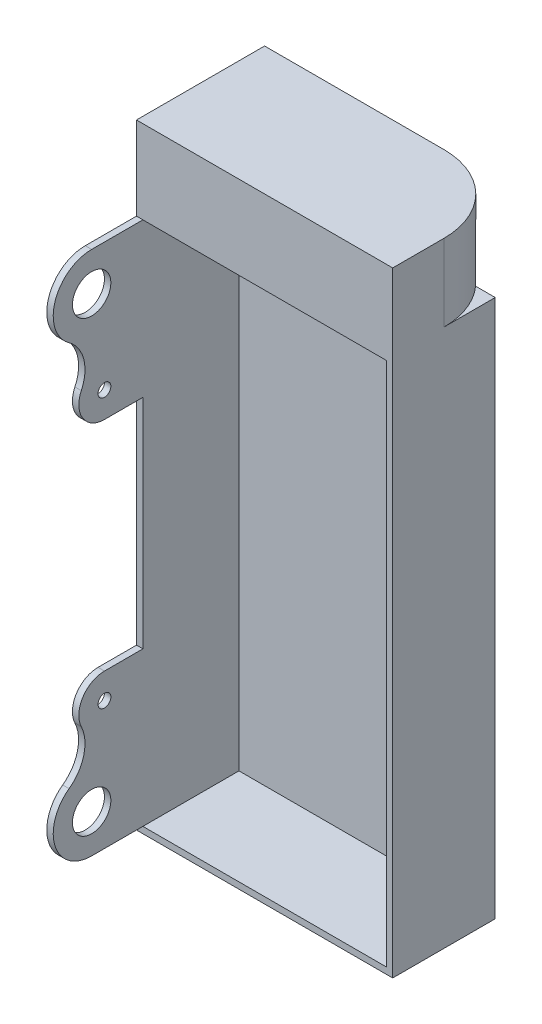
ISO-10303-21;
HEADER;
FILE_DESCRIPTION(('STEP AP214'),'2;1');
FILE_NAME('part.step','',(''),(''),'','','');
FILE_SCHEMA(('AUTOMOTIVE_DESIGN { 1 0 10303 214 1 1 1 1 }'));
ENDSEC;
DATA;
#1=APPLICATION_CONTEXT('core data for automotive mechanical design processes');
#2=APPLICATION_PROTOCOL_DEFINITION('international standard','automotive_design',2000,#1);
#3=PRODUCT_CONTEXT('',#1,'mechanical');
#4=PRODUCT('Part','Part','',(#3));
#5=PRODUCT_RELATED_PRODUCT_CATEGORY('part','',(#4));
#6=PRODUCT_DEFINITION_FORMATION('','',#4);
#7=PRODUCT_DEFINITION_CONTEXT('part definition',#1,'design');
#8=PRODUCT_DEFINITION('design','',#6,#7);
#9=PRODUCT_DEFINITION_SHAPE('','',#8);
#10=(LENGTH_UNIT() NAMED_UNIT(*) SI_UNIT(.MILLI.,.METRE.));
#11=(NAMED_UNIT(*) PLANE_ANGLE_UNIT() SI_UNIT($,.RADIAN.));
#12=(NAMED_UNIT(*) SI_UNIT($,.STERADIAN.) SOLID_ANGLE_UNIT());
#13=UNCERTAINTY_MEASURE_WITH_UNIT(LENGTH_MEASURE(1.E-05),#10,'distance_accuracy_value','');
#14=(GEOMETRIC_REPRESENTATION_CONTEXT(3) GLOBAL_UNCERTAINTY_ASSIGNED_CONTEXT((#13)) GLOBAL_UNIT_ASSIGNED_CONTEXT((#10,
#11,#12)) REPRESENTATION_CONTEXT('',''));
#15=CARTESIAN_POINT('',(0.,0.,0.));
#16=DIRECTION('',(0.,0.,1.));
#17=DIRECTION('',(1.,0.,0.));
#18=AXIS2_PLACEMENT_3D('',#15,#16,#17);
#19=CARTESIAN_POINT('',(0.,0.,25.4));
#20=DIRECTION('',(0.,0.,1.));
#21=DIRECTION('',(1.,0.,0.));
#22=AXIS2_PLACEMENT_3D('',#19,#20,#21);
#23=PLANE('',#22);
#24=DIRECTION('',(0.,-1.,0.));
#25=VECTOR('',#24,1.);
#26=CARTESIAN_POINT('',(-63.5,133.35,25.4));
#27=LINE('',#26,#25);
#28=CARTESIAN_POINT('',(-63.5,53.975,25.4));
#29=VERTEX_POINT('',#28);
#30=CARTESIAN_POINT('',(-63.5,-53.975,25.4));
#31=VERTEX_POINT('',#30);
#32=EDGE_CURVE('E438',#29,#31,#27,.T.);
#33=ORIENTED_EDGE('',*,*,#32,.T.);
#34=DIRECTION('',(-1.,0.,0.));
#35=VECTOR('',#34,1.);
#36=CARTESIAN_POINT('',(27.8920193330063,-53.975,25.4));
#37=LINE('',#36,#35);
#38=CARTESIAN_POINT('',(-60.325,-53.975,25.4));
#39=VERTEX_POINT('',#38);
#40=EDGE_CURVE('E271',#39,#31,#37,.T.);
#41=ORIENTED_EDGE('',*,*,#40,.F.);
#42=DIRECTION('',(0.,-1.,0.));
#43=VECTOR('',#42,1.);
#44=CARTESIAN_POINT('',(-60.325,133.35,25.4));
#45=LINE('',#44,#43);
#46=CARTESIAN_POINT('',(-60.325,53.975,25.4));
#47=VERTEX_POINT('',#46);
#48=EDGE_CURVE('E420',#47,#39,#45,.T.);
#49=ORIENTED_EDGE('',*,*,#48,.F.);
#50=DIRECTION('',(-1.,0.,0.));
#51=VECTOR('',#50,1.);
#52=CARTESIAN_POINT('',(27.8920193330063,53.975,25.4));
#53=LINE('',#52,#51);
#54=EDGE_CURVE('E377',#47,#29,#53,.T.);
#55=ORIENTED_EDGE('',*,*,#54,.T.);
#56=EDGE_LOOP('',(#33,#41,#49,#55));
#57=FACE_BOUND('',#56,.T.);
#58=ADVANCED_FACE('F39',(#57),#23,.T.);
#59=DIRECTION('',(1.,0.,0.));
#60=VECTOR('',#59,1.);
#61=CARTESIAN_POINT('',(-63.5,-130.175,25.4));
#62=LINE('',#61,#60);
#63=CARTESIAN_POINT('',(-60.325,-130.175,25.4));
#64=VERTEX_POINT('',#63);
#65=CARTESIAN_POINT('',(60.325,-130.175,25.4));
#66=VERTEX_POINT('',#65);
#67=EDGE_CURVE('E423',#64,#66,#62,.T.);
#68=ORIENTED_EDGE('',*,*,#67,.F.);
#69=DIRECTION('',(-1.,0.,0.));
#70=VECTOR('',#69,1.);
#71=CARTESIAN_POINT('',(27.8920193330063,-130.175,25.4));
#72=LINE('',#71,#70);
#73=CARTESIAN_POINT('',(-63.5,-130.175,25.4));
#74=VERTEX_POINT('',#73);
#75=EDGE_CURVE('E267',#64,#74,#72,.T.);
#76=ORIENTED_EDGE('',*,*,#75,.T.);
#77=CARTESIAN_POINT('',(-63.5,-133.35,25.4));
#78=VERTEX_POINT('',#77);
#79=EDGE_CURVE('E439',#74,#78,#27,.T.);
#80=ORIENTED_EDGE('',*,*,#79,.T.);
#81=DIRECTION('',(1.,0.,0.));
#82=VECTOR('',#81,1.);
#83=CARTESIAN_POINT('',(-63.5,-133.35,25.4));
#84=LINE('',#83,#82);
#85=CARTESIAN_POINT('',(63.5,-133.35,25.4));
#86=VERTEX_POINT('',#85);
#87=EDGE_CURVE('E437',#78,#86,#84,.T.);
#88=ORIENTED_EDGE('',*,*,#87,.T.);
#89=DIRECTION('',(0.,1.,0.));
#90=VECTOR('',#89,1.);
#91=CARTESIAN_POINT('',(63.5,133.35,25.4));
#92=LINE('',#91,#90);
#93=CARTESIAN_POINT('',(63.5,171.45,25.4));
#94=VERTEX_POINT('',#93);
#95=EDGE_CURVE('E442',#86,#94,#92,.T.);
#96=ORIENTED_EDGE('',*,*,#95,.T.);
#97=DIRECTION('',(1.,0.,0.));
#98=VECTOR('',#97,1.);
#99=CARTESIAN_POINT('',(63.5,171.45,25.4));
#100=LINE('',#99,#98);
#101=CARTESIAN_POINT('',(-63.5,171.45,25.4));
#102=VERTEX_POINT('',#101);
#103=EDGE_CURVE('E294',#102,#94,#100,.T.);
#104=ORIENTED_EDGE('',*,*,#103,.F.);
#105=CARTESIAN_POINT('',(-63.5,130.175,25.4));
#106=VERTEX_POINT('',#105);
#107=EDGE_CURVE('E433',#102,#106,#27,.T.);
#108=ORIENTED_EDGE('',*,*,#107,.T.);
#109=DIRECTION('',(-1.,0.,0.));
#110=VECTOR('',#109,1.);
#111=CARTESIAN_POINT('',(27.8920193330063,130.175,25.4));
#112=LINE('',#111,#110);
#113=CARTESIAN_POINT('',(-60.325,130.175,25.4));
#114=VERTEX_POINT('',#113);
#115=EDGE_CURVE('E359',#114,#106,#112,.T.);
#116=ORIENTED_EDGE('',*,*,#115,.F.);
#117=DIRECTION('',(-1.,0.,0.));
#118=VECTOR('',#117,1.);
#119=CARTESIAN_POINT('',(-63.5,130.175,25.4));
#120=LINE('',#119,#118);
#121=CARTESIAN_POINT('',(60.325,130.175,25.4));
#122=VERTEX_POINT('',#121);
#123=EDGE_CURVE('E405',#122,#114,#120,.T.);
#124=ORIENTED_EDGE('',*,*,#123,.F.);
#125=DIRECTION('',(0.,1.,0.));
#126=VECTOR('',#125,1.);
#127=CARTESIAN_POINT('',(60.325,133.35,25.4));
#128=LINE('',#127,#126);
#129=EDGE_CURVE('E426',#66,#122,#128,.T.);
#130=ORIENTED_EDGE('',*,*,#129,.F.);
#131=EDGE_LOOP('',(#68,#76,#80,#88,#96,#104,#108,#116,#124,#130));
#132=FACE_BOUND('',#131,.T.);
#133=ADVANCED_FACE('F489',(#132),#23,.T.);
#134=CARTESIAN_POINT('',(-63.5,133.35,25.4));
#135=DIRECTION('',(1.,0.,0.));
#136=DIRECTION('',(0.,1.,0.));
#137=AXIS2_PLACEMENT_3D('',#134,#135,#136);
#138=PLANE('',#137);
#139=DIRECTION('',(0.,-1.,0.));
#140=VECTOR('',#139,1.);
#141=CARTESIAN_POINT('',(-63.5,133.35,-25.4));
#142=LINE('',#141,#140);
#143=CARTESIAN_POINT('',(-63.5,133.35,-25.4));
#144=VERTEX_POINT('',#143);
#145=CARTESIAN_POINT('',(-63.5,-133.35,-25.4));
#146=VERTEX_POINT('',#145);
#147=EDGE_CURVE('E398',#144,#146,#142,.T.);
#148=ORIENTED_EDGE('',*,*,#147,.T.);
#149=DIRECTION('',(0.,0.,-1.));
#150=VECTOR('',#149,1.);
#151=CARTESIAN_POINT('',(-63.5,-133.35,25.4));
#152=LINE('',#151,#150);
#153=EDGE_CURVE('E11',#78,#146,#152,.T.);
#154=ORIENTED_EDGE('',*,*,#153,.F.);
#155=ORIENTED_EDGE('',*,*,#79,.F.);
#156=DIRECTION('',(0.,0.,-1.));
#157=VECTOR('',#156,1.);
#158=CARTESIAN_POINT('',(-63.5,-130.175,50.8));
#159=LINE('',#158,#157);
#160=CARTESIAN_POINT('',(-63.5,-130.175,50.8));
#161=VERTEX_POINT('',#160);
#162=EDGE_CURVE('E255',#161,#74,#159,.T.);
#163=ORIENTED_EDGE('',*,*,#162,.F.);
#164=CARTESIAN_POINT('',(-63.5,-111.125,50.8));
#165=DIRECTION('',(1.,0.,0.));
#166=DIRECTION('',(0.,1.,0.));
#167=AXIS2_PLACEMENT_3D('',#164,#165,#166);
#168=CIRCLE('',#167,19.05);
#169=CARTESIAN_POINT('',(-63.5,-95.6950382129115,61.9722325096191));
#170=VERTEX_POINT('',#169);
#171=EDGE_CURVE('E206',#170,#161,#168,.T.);
#172=ORIENTED_EDGE('',*,*,#171,.F.);
#173=CARTESIAN_POINT('',(-63.5,-80.2650764258231,73.1444650192382));
#174=DIRECTION('',(-1.,0.,0.));
#175=DIRECTION('',(0.,1.,0.));
#176=AXIS2_PLACEMENT_3D('',#173,#174,#175);
#177=CIRCLE('',#176,19.05);
#178=CARTESIAN_POINT('',(-63.5,-72.1110305703292,55.9277860076953));
#179=VERTEX_POINT('',#178);
#180=EDGE_CURVE('E246',#179,#170,#177,.T.);
#181=ORIENTED_EDGE('',*,*,#180,.F.);
#182=CARTESIAN_POINT('',(-63.5,-66.675,44.45));
#183=DIRECTION('',(1.,0.,0.));
#184=DIRECTION('',(0.,1.,0.));
#185=AXIS2_PLACEMENT_3D('',#182,#183,#184);
#186=CIRCLE('',#185,12.7);
#187=CARTESIAN_POINT('',(-63.5,-53.975,44.45));
#188=VERTEX_POINT('',#187);
#189=EDGE_CURVE('E200',#188,#179,#186,.T.);
#190=ORIENTED_EDGE('',*,*,#189,.F.);
#191=DIRECTION('',(0.,0.,1.));
#192=VECTOR('',#191,1.);
#193=CARTESIAN_POINT('',(-63.5,-53.975,44.45));
#194=LINE('',#193,#192);
#195=EDGE_CURVE('E251',#31,#188,#194,.T.);
#196=ORIENTED_EDGE('',*,*,#195,.F.);
#197=ORIENTED_EDGE('',*,*,#32,.F.);
#198=DIRECTION('',(0.,0.,1.));
#199=VECTOR('',#198,1.);
#200=CARTESIAN_POINT('',(-63.5,53.975,44.45));
#201=LINE('',#200,#199);
#202=CARTESIAN_POINT('',(-63.5,53.975,44.45));
#203=VERTEX_POINT('',#202);
#204=EDGE_CURVE('E63',#29,#203,#201,.T.);
#205=ORIENTED_EDGE('',*,*,#204,.T.);
#206=CARTESIAN_POINT('',(-63.5,66.675,44.45));
#207=DIRECTION('',(-1.,0.,0.));
#208=DIRECTION('',(0.,-1.,0.));
#209=AXIS2_PLACEMENT_3D('',#206,#207,#208);
#210=CIRCLE('',#209,12.7);
#211=CARTESIAN_POINT('',(-63.5,72.1110305703292,55.9277860076953));
#212=VERTEX_POINT('',#211);
#213=EDGE_CURVE('E319',#203,#212,#210,.T.);
#214=ORIENTED_EDGE('',*,*,#213,.T.);
#215=CARTESIAN_POINT('',(-63.5,80.2650764258231,73.1444650192382));
#216=DIRECTION('',(1.,0.,0.));
#217=DIRECTION('',(0.,-1.,0.));
#218=AXIS2_PLACEMENT_3D('',#215,#216,#217);
#219=CIRCLE('',#218,19.05);
#220=CARTESIAN_POINT('',(-63.5,95.6950382129115,61.9722325096191));
#221=VERTEX_POINT('',#220);
#222=EDGE_CURVE('E334',#212,#221,#219,.T.);
#223=ORIENTED_EDGE('',*,*,#222,.T.);
#224=CARTESIAN_POINT('',(-63.5,111.125,50.8));
#225=DIRECTION('',(-1.,0.,0.));
#226=DIRECTION('',(0.,-1.,0.));
#227=AXIS2_PLACEMENT_3D('',#224,#225,#226);
#228=CIRCLE('',#227,19.05);
#229=CARTESIAN_POINT('',(-63.5,130.175,50.8));
#230=VERTEX_POINT('',#229);
#231=EDGE_CURVE('E330',#221,#230,#228,.T.);
#232=ORIENTED_EDGE('',*,*,#231,.T.);
#233=DIRECTION('',(0.,0.,-1.));
#234=VECTOR('',#233,1.);
#235=CARTESIAN_POINT('',(-63.5,130.175,50.8));
#236=LINE('',#235,#234);
#237=EDGE_CURVE('E326',#230,#106,#236,.T.);
#238=ORIENTED_EDGE('',*,*,#237,.T.);
#239=ORIENTED_EDGE('',*,*,#107,.F.);
#240=DIRECTION('',(0.,0.,1.));
#241=VECTOR('',#240,1.);
#242=CARTESIAN_POINT('',(-63.5,171.45,25.4));
#243=LINE('',#242,#241);
#244=CARTESIAN_POINT('',(-63.5,171.45,-38.1));
#245=VERTEX_POINT('',#244);
#246=EDGE_CURVE('E290',#245,#102,#243,.T.);
#247=ORIENTED_EDGE('',*,*,#246,.F.);
#248=DIRECTION('',(0.,-1.,0.));
#249=VECTOR('',#248,1.);
#250=CARTESIAN_POINT('',(-63.5,171.45,-38.1));
#251=LINE('',#250,#249);
#252=CARTESIAN_POINT('',(-63.5,133.35,-38.1));
#253=VERTEX_POINT('',#252);
#254=EDGE_CURVE('E298',#245,#253,#251,.T.);
#255=ORIENTED_EDGE('',*,*,#254,.T.);
#256=DIRECTION('',(0.,0.,1.));
#257=VECTOR('',#256,1.);
#258=CARTESIAN_POINT('',(-63.5,133.35,25.4));
#259=LINE('',#258,#257);
#260=EDGE_CURVE('E284',#253,#144,#259,.T.);
#261=ORIENTED_EDGE('',*,*,#260,.T.);
#262=EDGE_LOOP('',(#148,#154,#155,#163,#172,#181,#190,#196,#197,#205,#214,#223,#232,#238,#239,
#247,#255,#261));
#263=FACE_BOUND('',#262,.T.);
#264=CARTESIAN_POINT('',(-63.5,66.675,44.45));
#265=DIRECTION('',(-1.,0.,0.));
#266=DIRECTION('',(0.,-1.,0.));
#267=AXIS2_PLACEMENT_3D('',#264,#265,#266);
#268=CIRCLE('',#267,3.175);
#269=CARTESIAN_POINT('',(-63.5,63.5,44.45));
#270=VERTEX_POINT('',#269);
#271=EDGE_CURVE('E338',#270,#270,#268,.T.);
#272=ORIENTED_EDGE('',*,*,#271,.F.);
#273=EDGE_LOOP('',(#272));
#274=FACE_BOUND('',#273,.T.);
#275=CARTESIAN_POINT('',(-63.5,111.125,50.8));
#276=DIRECTION('',(-1.,0.,0.));
#277=DIRECTION('',(0.,-1.,0.));
#278=AXIS2_PLACEMENT_3D('',#275,#276,#277);
#279=CIRCLE('',#278,9.52500000000001);
#280=CARTESIAN_POINT('',(-63.5,101.6,50.8));
#281=VERTEX_POINT('',#280);
#282=EDGE_CURVE('E339',#281,#281,#279,.T.);
#283=ORIENTED_EDGE('',*,*,#282,.F.);
#284=EDGE_LOOP('',(#283));
#285=FACE_BOUND('',#284,.T.);
#286=CARTESIAN_POINT('',(-63.5,-111.125,50.8));
#287=DIRECTION('',(1.,0.,0.));
#288=DIRECTION('',(0.,1.,0.));
#289=AXIS2_PLACEMENT_3D('',#286,#287,#288);
#290=CIRCLE('',#289,9.52500000000001);
#291=CARTESIAN_POINT('',(-63.5,-101.6,50.8));
#292=VERTEX_POINT('',#291);
#293=EDGE_CURVE('E242',#292,#292,#290,.T.);
#294=ORIENTED_EDGE('',*,*,#293,.T.);
#295=EDGE_LOOP('',(#294));
#296=FACE_BOUND('',#295,.T.);
#297=CARTESIAN_POINT('',(-63.5,-66.675,44.45));
#298=DIRECTION('',(1.,0.,0.));
#299=DIRECTION('',(0.,1.,0.));
#300=AXIS2_PLACEMENT_3D('',#297,#298,#299);
#301=CIRCLE('',#300,3.175);
#302=CARTESIAN_POINT('',(-63.5,-63.5,44.45));
#303=VERTEX_POINT('',#302);
#304=EDGE_CURVE('E216',#303,#303,#301,.T.);
#305=ORIENTED_EDGE('',*,*,#304,.T.);
#306=EDGE_LOOP('',(#305));
#307=FACE_BOUND('',#306,.T.);
#308=ADVANCED_FACE('F41',(#263,#274,#285,#296,#307),#138,.F.);
#309=CARTESIAN_POINT('',(-63.5,-133.35,25.4));
#310=DIRECTION('',(0.,1.,0.));
#311=DIRECTION('',(0.,0.,1.));
#312=AXIS2_PLACEMENT_3D('',#309,#310,#311);
#313=PLANE('',#312);
#314=DIRECTION('',(1.,0.,0.));
#315=VECTOR('',#314,1.);
#316=CARTESIAN_POINT('',(-63.5,-133.35,-25.4));
#317=LINE('',#316,#315);
#318=CARTESIAN_POINT('',(63.5,-133.35,-25.4));
#319=VERTEX_POINT('',#318);
#320=EDGE_CURVE('E449',#146,#319,#317,.T.);
#321=ORIENTED_EDGE('',*,*,#320,.T.);
#322=DIRECTION('',(0.,0.,-1.));
#323=VECTOR('',#322,1.);
#324=CARTESIAN_POINT('',(63.5,-133.35,25.4));
#325=LINE('',#324,#323);
#326=EDGE_CURVE('E48',#86,#319,#325,.T.);
#327=ORIENTED_EDGE('',*,*,#326,.F.);
#328=ORIENTED_EDGE('',*,*,#87,.F.);
#329=ORIENTED_EDGE('',*,*,#153,.T.);
#330=EDGE_LOOP('',(#321,#327,#328,#329));
#331=FACE_BOUND('',#330,.T.);
#332=ADVANCED_FACE('F493',(#331),#313,.F.);
#333=CARTESIAN_POINT('',(63.5,133.35,25.4));
#334=DIRECTION('',(-1.,0.,0.));
#335=DIRECTION('',(0.,-1.,0.));
#336=AXIS2_PLACEMENT_3D('',#333,#334,#335);
#337=PLANE('',#336);
#338=DIRECTION('',(0.,1.,0.));
#339=VECTOR('',#338,1.);
#340=CARTESIAN_POINT('',(63.5,133.35,-25.4));
#341=LINE('',#340,#339);
#342=CARTESIAN_POINT('',(63.5,133.35,-25.4));
#343=VERTEX_POINT('',#342);
#344=EDGE_CURVE('E452',#319,#343,#341,.T.);
#345=ORIENTED_EDGE('',*,*,#344,.T.);
#346=DIRECTION('',(0.,0.,-1.));
#347=VECTOR('',#346,1.);
#348=CARTESIAN_POINT('',(63.5,133.35,25.4));
#349=LINE('',#348,#347);
#350=CARTESIAN_POINT('',(63.5,133.35,0.));
#351=VERTEX_POINT('',#350);
#352=EDGE_CURVE('E445',#351,#343,#349,.T.);
#353=ORIENTED_EDGE('',*,*,#352,.F.);
#354=DIRECTION('',(0.,-1.,0.));
#355=VECTOR('',#354,1.);
#356=CARTESIAN_POINT('',(63.5,171.45,0.));
#357=LINE('',#356,#355);
#358=CARTESIAN_POINT('',(63.5,171.45,0.));
#359=VERTEX_POINT('',#358);
#360=EDGE_CURVE('E314',#359,#351,#357,.T.);
#361=ORIENTED_EDGE('',*,*,#360,.F.);
#362=DIRECTION('',(0.,0.,-1.));
#363=VECTOR('',#362,1.);
#364=CARTESIAN_POINT('',(63.5,171.45,25.4));
#365=LINE('',#364,#363);
#366=EDGE_CURVE('E279',#94,#359,#365,.T.);
#367=ORIENTED_EDGE('',*,*,#366,.F.);
#368=ORIENTED_EDGE('',*,*,#95,.F.);
#369=ORIENTED_EDGE('',*,*,#326,.T.);
#370=EDGE_LOOP('',(#345,#353,#361,#367,#368,#369));
#371=FACE_BOUND('',#370,.T.);
#372=ADVANCED_FACE('F467',(#371),#337,.F.);
#373=CARTESIAN_POINT('',(-63.5,133.35,25.4));
#374=DIRECTION('',(0.,-1.,0.));
#375=DIRECTION('',(0.,0.,-1.));
#376=AXIS2_PLACEMENT_3D('',#373,#374,#375);
#377=PLANE('',#376);
#378=CARTESIAN_POINT('',(25.4,133.35,0.));
#379=DIRECTION('',(0.,1.,0.));
#380=DIRECTION('',(0.,0.,-1.));
#381=AXIS2_PLACEMENT_3D('',#378,#379,#380);
#382=CIRCLE('',#381,38.1);
#383=CARTESIAN_POINT('',(53.7980633142473,133.35,-25.4));
#384=VERTEX_POINT('',#383);
#385=EDGE_CURVE('E55',#351,#384,#382,.T.);
#386=ORIENTED_EDGE('',*,*,#385,.F.);
#387=ORIENTED_EDGE('',*,*,#352,.T.);
#388=DIRECTION('',(-1.,0.,0.));
#389=VECTOR('',#388,1.);
#390=CARTESIAN_POINT('',(-63.5,133.35,-25.4));
#391=LINE('',#390,#389);
#392=EDGE_CURVE('E457',#343,#384,#391,.T.);
#393=ORIENTED_EDGE('',*,*,#392,.T.);
#394=EDGE_LOOP('',(#386,#387,#393));
#395=FACE_BOUND('',#394,.T.);
#396=ADVANCED_FACE('F477',(#395),#377,.F.);
#397=CARTESIAN_POINT('',(0.,0.,-25.4));
#398=DIRECTION('',(0.,0.,1.));
#399=DIRECTION('',(1.,0.,0.));
#400=AXIS2_PLACEMENT_3D('',#397,#398,#399);
#401=PLANE('',#400);
#402=ORIENTED_EDGE('',*,*,#147,.F.);
#403=EDGE_CURVE('E456',#384,#144,#391,.T.);
#404=ORIENTED_EDGE('',*,*,#403,.F.);
#405=ORIENTED_EDGE('',*,*,#392,.F.);
#406=ORIENTED_EDGE('',*,*,#344,.F.);
#407=ORIENTED_EDGE('',*,*,#320,.F.);
#408=EDGE_LOOP('',(#402,#404,#405,#406,#407));
#409=FACE_BOUND('',#408,.T.);
#410=ADVANCED_FACE('F473',(#409),#401,.F.);
#411=CARTESIAN_POINT('',(-60.325,133.35,25.4));
#412=DIRECTION('',(1.,0.,0.));
#413=DIRECTION('',(0.,1.,0.));
#414=AXIS2_PLACEMENT_3D('',#411,#412,#413);
#415=PLANE('',#414);
#416=DIRECTION('',(0.,-1.,0.));
#417=VECTOR('',#416,1.);
#418=CARTESIAN_POINT('',(-60.325,133.35,-22.225));
#419=LINE('',#418,#417);
#420=CARTESIAN_POINT('',(-60.325,130.175,-22.225));
#421=VERTEX_POINT('',#420);
#422=CARTESIAN_POINT('',(-60.325,-130.175,-22.225));
#423=VERTEX_POINT('',#422);
#424=EDGE_CURVE('E351',#421,#423,#419,.T.);
#425=ORIENTED_EDGE('',*,*,#424,.F.);
#426=DIRECTION('',(0.,0.,-1.));
#427=VECTOR('',#426,1.);
#428=CARTESIAN_POINT('',(-60.325,130.175,25.4));
#429=LINE('',#428,#427);
#430=EDGE_CURVE('E400',#114,#421,#429,.T.);
#431=ORIENTED_EDGE('',*,*,#430,.F.);
#432=DIRECTION('',(0.,0.,-1.));
#433=VECTOR('',#432,1.);
#434=CARTESIAN_POINT('',(-60.325,130.175,50.8));
#435=LINE('',#434,#433);
#436=CARTESIAN_POINT('',(-60.325,130.175,50.8));
#437=VERTEX_POINT('',#436);
#438=EDGE_CURVE('E374',#437,#114,#435,.T.);
#439=ORIENTED_EDGE('',*,*,#438,.F.);
#440=CARTESIAN_POINT('',(-60.325,111.125,50.8));
#441=DIRECTION('',(1.,0.,0.));
#442=DIRECTION('',(0.,1.,0.));
#443=AXIS2_PLACEMENT_3D('',#440,#441,#442);
#444=CIRCLE('',#443,19.05);
#445=CARTESIAN_POINT('',(-60.325,95.6950382129115,61.9722325096191));
#446=VERTEX_POINT('',#445);
#447=EDGE_CURVE('E355',#446,#437,#444,.F.);
#448=ORIENTED_EDGE('',*,*,#447,.F.);
#449=CARTESIAN_POINT('',(-60.325,80.2650764258231,73.1444650192382));
#450=DIRECTION('',(1.,0.,0.));
#451=DIRECTION('',(0.,1.,0.));
#452=AXIS2_PLACEMENT_3D('',#449,#450,#451);
#453=CIRCLE('',#452,19.05);
#454=CARTESIAN_POINT('',(-60.325,72.1110305703292,55.9277860076953));
#455=VERTEX_POINT('',#454);
#456=EDGE_CURVE('E318',#455,#446,#453,.T.);
#457=ORIENTED_EDGE('',*,*,#456,.F.);
#458=CARTESIAN_POINT('',(-60.325,66.675,44.45));
#459=DIRECTION('',(1.,0.,0.));
#460=DIRECTION('',(0.,1.,0.));
#461=AXIS2_PLACEMENT_3D('',#458,#459,#460);
#462=CIRCLE('',#461,12.7);
#463=CARTESIAN_POINT('',(-60.325,53.975,44.45));
#464=VERTEX_POINT('',#463);
#465=EDGE_CURVE('E364',#464,#455,#462,.F.);
#466=ORIENTED_EDGE('',*,*,#465,.F.);
#467=DIRECTION('',(0.,0.,1.));
#468=VECTOR('',#467,1.);
#469=CARTESIAN_POINT('',(-60.325,53.975,44.45));
#470=LINE('',#469,#468);
#471=EDGE_CURVE('E369',#47,#464,#470,.T.);
#472=ORIENTED_EDGE('',*,*,#471,.F.);
#473=ORIENTED_EDGE('',*,*,#48,.T.);
#474=DIRECTION('',(0.,0.,1.));
#475=VECTOR('',#474,1.);
#476=CARTESIAN_POINT('',(-60.325,-53.975,44.45));
#477=LINE('',#476,#475);
#478=CARTESIAN_POINT('',(-60.325,-53.975,44.45));
#479=VERTEX_POINT('',#478);
#480=EDGE_CURVE('E223',#39,#479,#477,.T.);
#481=ORIENTED_EDGE('',*,*,#480,.T.);
#482=CARTESIAN_POINT('',(-60.325,-66.675,44.45));
#483=DIRECTION('',(1.,0.,0.));
#484=DIRECTION('',(0.,1.,0.));
#485=AXIS2_PLACEMENT_3D('',#482,#483,#484);
#486=CIRCLE('',#485,12.7);
#487=CARTESIAN_POINT('',(-60.325,-72.1110305703292,55.9277860076953));
#488=VERTEX_POINT('',#487);
#489=EDGE_CURVE('E197',#479,#488,#486,.T.);
#490=ORIENTED_EDGE('',*,*,#489,.T.);
#491=CARTESIAN_POINT('',(-60.325,-80.2650764258231,73.1444650192382));
#492=DIRECTION('',(1.,0.,0.));
#493=DIRECTION('',(0.,1.,0.));
#494=AXIS2_PLACEMENT_3D('',#491,#492,#493);
#495=CIRCLE('',#494,19.05);
#496=CARTESIAN_POINT('',(-60.325,-95.6950382129115,61.9722325096191));
#497=VERTEX_POINT('',#496);
#498=EDGE_CURVE('E210',#488,#497,#495,.F.);
#499=ORIENTED_EDGE('',*,*,#498,.T.);
#500=CARTESIAN_POINT('',(-60.325,-111.125,50.8));
#501=DIRECTION('',(1.,0.,0.));
#502=DIRECTION('',(0.,1.,0.));
#503=AXIS2_PLACEMENT_3D('',#500,#501,#502);
#504=CIRCLE('',#503,19.05);
#505=CARTESIAN_POINT('',(-60.325,-130.175,50.8));
#506=VERTEX_POINT('',#505);
#507=EDGE_CURVE('E217',#497,#506,#504,.T.);
#508=ORIENTED_EDGE('',*,*,#507,.T.);
#509=DIRECTION('',(0.,0.,-1.));
#510=VECTOR('',#509,1.);
#511=CARTESIAN_POINT('',(-60.325,-130.175,50.8));
#512=LINE('',#511,#510);
#513=EDGE_CURVE('E229',#506,#64,#512,.T.);
#514=ORIENTED_EDGE('',*,*,#513,.T.);
#515=DIRECTION('',(0.,0.,-1.));
#516=VECTOR('',#515,1.);
#517=CARTESIAN_POINT('',(-60.325,-130.175,25.4));
#518=LINE('',#517,#516);
#519=EDGE_CURVE('E394',#64,#423,#518,.T.);
#520=ORIENTED_EDGE('',*,*,#519,.T.);
#521=EDGE_LOOP('',(#425,#431,#439,#448,#457,#466,#472,#473,#481,#490,#499,#508,#514,#520));
#522=FACE_BOUND('',#521,.T.);
#523=CARTESIAN_POINT('',(-60.325,66.675,44.45));
#524=DIRECTION('',(1.,0.,0.));
#525=DIRECTION('',(0.,1.,0.));
#526=AXIS2_PLACEMENT_3D('',#523,#524,#525);
#527=CIRCLE('',#526,3.175);
#528=CARTESIAN_POINT('',(-60.325,69.85,44.45));
#529=VERTEX_POINT('',#528);
#530=EDGE_CURVE('E323',#529,#529,#527,.F.);
#531=ORIENTED_EDGE('',*,*,#530,.T.);
#532=EDGE_LOOP('',(#531));
#533=FACE_BOUND('',#532,.T.);
#534=CARTESIAN_POINT('',(-60.325,111.125,50.8));
#535=DIRECTION('',(1.,0.,0.));
#536=DIRECTION('',(0.,1.,0.));
#537=AXIS2_PLACEMENT_3D('',#534,#535,#536);
#538=CIRCLE('',#537,9.52500000000001);
#539=CARTESIAN_POINT('',(-60.325,120.65,50.8));
#540=VERTEX_POINT('',#539);
#541=EDGE_CURVE('E347',#540,#540,#538,.F.);
#542=ORIENTED_EDGE('',*,*,#541,.T.);
#543=EDGE_LOOP('',(#542));
#544=FACE_BOUND('',#543,.T.);
#545=CARTESIAN_POINT('',(-60.325,-66.675,44.45));
#546=DIRECTION('',(1.,0.,0.));
#547=DIRECTION('',(0.,1.,0.));
#548=AXIS2_PLACEMENT_3D('',#545,#546,#547);
#549=CIRCLE('',#548,3.175);
#550=CARTESIAN_POINT('',(-60.325,-63.5,44.45));
#551=VERTEX_POINT('',#550);
#552=EDGE_CURVE('E232',#551,#551,#549,.T.);
#553=ORIENTED_EDGE('',*,*,#552,.F.);
#554=EDGE_LOOP('',(#553));
#555=FACE_BOUND('',#554,.T.);
#556=CARTESIAN_POINT('',(-60.325,-111.125,50.8));
#557=DIRECTION('',(1.,0.,0.));
#558=DIRECTION('',(0.,1.,0.));
#559=AXIS2_PLACEMENT_3D('',#556,#557,#558);
#560=CIRCLE('',#559,9.52500000000001);
#561=CARTESIAN_POINT('',(-60.325,-101.6,50.8));
#562=VERTEX_POINT('',#561);
#563=EDGE_CURVE('E225',#562,#562,#560,.T.);
#564=ORIENTED_EDGE('',*,*,#563,.F.);
#565=EDGE_LOOP('',(#564));
#566=FACE_BOUND('',#565,.T.);
#567=ADVANCED_FACE('F220',(#522,#533,#544,#555,#566),#415,.T.);
#568=CARTESIAN_POINT('',(-63.5,-130.175,25.4));
#569=DIRECTION('',(0.,1.,0.));
#570=DIRECTION('',(0.,0.,1.));
#571=AXIS2_PLACEMENT_3D('',#568,#569,#570);
#572=PLANE('',#571);
#573=DIRECTION('',(1.,0.,0.));
#574=VECTOR('',#573,1.);
#575=CARTESIAN_POINT('',(-63.5,-130.175,-22.225));
#576=LINE('',#575,#574);
#577=CARTESIAN_POINT('',(60.325,-130.175,-22.225));
#578=VERTEX_POINT('',#577);
#579=EDGE_CURVE('E393',#423,#578,#576,.T.);
#580=ORIENTED_EDGE('',*,*,#579,.F.);
#581=ORIENTED_EDGE('',*,*,#519,.F.);
#582=ORIENTED_EDGE('',*,*,#67,.T.);
#583=DIRECTION('',(0.,0.,-1.));
#584=VECTOR('',#583,1.);
#585=CARTESIAN_POINT('',(60.325,-130.175,25.4));
#586=LINE('',#585,#584);
#587=EDGE_CURVE('E399',#66,#578,#586,.T.);
#588=ORIENTED_EDGE('',*,*,#587,.T.);
#589=EDGE_LOOP('',(#580,#581,#582,#588));
#590=FACE_BOUND('',#589,.T.);
#591=ADVANCED_FACE('F527',(#590),#572,.T.);
#592=CARTESIAN_POINT('',(60.325,133.35,25.4));
#593=DIRECTION('',(-1.,0.,0.));
#594=DIRECTION('',(0.,-1.,0.));
#595=AXIS2_PLACEMENT_3D('',#592,#593,#594);
#596=PLANE('',#595);
#597=DIRECTION('',(0.,1.,0.));
#598=VECTOR('',#597,1.);
#599=CARTESIAN_POINT('',(60.325,133.35,-22.225));
#600=LINE('',#599,#598);
#601=CARTESIAN_POINT('',(60.325,130.175,-22.225));
#602=VERTEX_POINT('',#601);
#603=EDGE_CURVE('E408',#578,#602,#600,.T.);
#604=ORIENTED_EDGE('',*,*,#603,.F.);
#605=ORIENTED_EDGE('',*,*,#587,.F.);
#606=ORIENTED_EDGE('',*,*,#129,.T.);
#607=DIRECTION('',(0.,0.,-1.));
#608=VECTOR('',#607,1.);
#609=CARTESIAN_POINT('',(60.325,130.175,25.4));
#610=LINE('',#609,#608);
#611=EDGE_CURVE('E404',#122,#602,#610,.T.);
#612=ORIENTED_EDGE('',*,*,#611,.T.);
#613=EDGE_LOOP('',(#604,#605,#606,#612));
#614=FACE_BOUND('',#613,.T.);
#615=ADVANCED_FACE('F524',(#614),#596,.T.);
#616=CARTESIAN_POINT('',(-63.5,130.175,25.4));
#617=DIRECTION('',(0.,-1.,0.));
#618=DIRECTION('',(0.,0.,-1.));
#619=AXIS2_PLACEMENT_3D('',#616,#617,#618);
#620=PLANE('',#619);
#621=DIRECTION('',(-1.,0.,0.));
#622=VECTOR('',#621,1.);
#623=CARTESIAN_POINT('',(-63.5,130.175,-22.225));
#624=LINE('',#623,#622);
#625=EDGE_CURVE('E414',#602,#421,#624,.T.);
#626=ORIENTED_EDGE('',*,*,#625,.F.);
#627=ORIENTED_EDGE('',*,*,#611,.F.);
#628=ORIENTED_EDGE('',*,*,#123,.T.);
#629=ORIENTED_EDGE('',*,*,#430,.T.);
#630=EDGE_LOOP('',(#626,#627,#628,#629));
#631=FACE_BOUND('',#630,.T.);
#632=ADVANCED_FACE('F517',(#631),#620,.T.);
#633=CARTESIAN_POINT('',(0.,0.,-22.225));
#634=DIRECTION('',(0.,0.,1.));
#635=DIRECTION('',(1.,0.,0.));
#636=AXIS2_PLACEMENT_3D('',#633,#634,#635);
#637=PLANE('',#636);
#638=ORIENTED_EDGE('',*,*,#424,.T.);
#639=ORIENTED_EDGE('',*,*,#579,.T.);
#640=ORIENTED_EDGE('',*,*,#603,.T.);
#641=ORIENTED_EDGE('',*,*,#625,.T.);
#642=EDGE_LOOP('',(#638,#639,#640,#641));
#643=FACE_BOUND('',#642,.T.);
#644=ADVANCED_FACE('F520',(#643),#637,.T.);
#645=CARTESIAN_POINT('',(27.8920193330063,80.2650764258231,73.1444650192382));
#646=DIRECTION('',(-1.,0.,0.));
#647=DIRECTION('',(0.,-1.,0.));
#648=AXIS2_PLACEMENT_3D('',#645,#646,#647);
#649=CYLINDRICAL_SURFACE('',#648,19.05);
#650=DIRECTION('',(-1.,0.,0.));
#651=VECTOR('',#650,1.);
#652=CARTESIAN_POINT('',(27.8920193330063,72.1110305703292,55.9277860076953));
#653=LINE('',#652,#651);
#654=EDGE_CURVE('E368',#455,#212,#653,.T.);
#655=ORIENTED_EDGE('',*,*,#654,.F.);
#656=ORIENTED_EDGE('',*,*,#456,.T.);
#657=DIRECTION('',(-1.,0.,0.));
#658=VECTOR('',#657,1.);
#659=CARTESIAN_POINT('',(27.8920193330063,95.6950382129115,61.9722325096191));
#660=LINE('',#659,#658);
#661=EDGE_CURVE('E363',#446,#221,#660,.T.);
#662=ORIENTED_EDGE('',*,*,#661,.T.);
#663=ORIENTED_EDGE('',*,*,#222,.F.);
#664=EDGE_LOOP('',(#655,#656,#662,#663));
#665=FACE_BOUND('',#664,.T.);
#666=ADVANCED_FACE('F679',(#665),#649,.F.);
#667=CARTESIAN_POINT('',(27.8920193330063,66.675,44.45));
#668=DIRECTION('',(-1.,0.,0.));
#669=DIRECTION('',(0.,-1.,0.));
#670=AXIS2_PLACEMENT_3D('',#667,#668,#669);
#671=CYLINDRICAL_SURFACE('',#670,12.7);
#672=DIRECTION('',(-1.,0.,0.));
#673=VECTOR('',#672,1.);
#674=CARTESIAN_POINT('',(27.8920193330063,53.975,44.45));
#675=LINE('',#674,#673);
#676=EDGE_CURVE('E373',#464,#203,#675,.T.);
#677=ORIENTED_EDGE('',*,*,#676,.F.);
#678=ORIENTED_EDGE('',*,*,#465,.T.);
#679=ORIENTED_EDGE('',*,*,#654,.T.);
#680=ORIENTED_EDGE('',*,*,#213,.F.);
#681=EDGE_LOOP('',(#677,#678,#679,#680));
#682=FACE_BOUND('',#681,.T.);
#683=ADVANCED_FACE('F670',(#682),#671,.T.);
#684=CARTESIAN_POINT('',(27.8920193330063,53.975,44.45));
#685=DIRECTION('',(0.,-1.,0.));
#686=DIRECTION('',(0.,0.,-1.));
#687=AXIS2_PLACEMENT_3D('',#684,#685,#686);
#688=PLANE('',#687);
#689=ORIENTED_EDGE('',*,*,#54,.F.);
#690=ORIENTED_EDGE('',*,*,#471,.T.);
#691=ORIENTED_EDGE('',*,*,#676,.T.);
#692=ORIENTED_EDGE('',*,*,#204,.F.);
#693=EDGE_LOOP('',(#689,#690,#691,#692));
#694=FACE_BOUND('',#693,.T.);
#695=ADVANCED_FACE('F661',(#694),#688,.T.);
#696=CARTESIAN_POINT('',(27.8920193330063,130.175,50.8));
#697=DIRECTION('',(0.,1.,0.));
#698=DIRECTION('',(-1.,0.,0.));
#699=AXIS2_PLACEMENT_3D('',#696,#697,#698);
#700=PLANE('',#699);
#701=DIRECTION('',(-1.,0.,0.));
#702=VECTOR('',#701,1.);
#703=CARTESIAN_POINT('',(27.8920193330063,130.175,50.8));
#704=LINE('',#703,#702);
#705=EDGE_CURVE('E343',#437,#230,#704,.T.);
#706=ORIENTED_EDGE('',*,*,#705,.F.);
#707=ORIENTED_EDGE('',*,*,#438,.T.);
#708=ORIENTED_EDGE('',*,*,#115,.T.);
#709=ORIENTED_EDGE('',*,*,#237,.F.);
#710=EDGE_LOOP('',(#706,#707,#708,#709));
#711=FACE_BOUND('',#710,.T.);
#712=ADVANCED_FACE('F511',(#711),#700,.T.);
#713=CARTESIAN_POINT('',(27.8920193330063,111.125,50.8));
#714=DIRECTION('',(-1.,0.,0.));
#715=DIRECTION('',(0.,-1.,0.));
#716=AXIS2_PLACEMENT_3D('',#713,#714,#715);
#717=CYLINDRICAL_SURFACE('',#716,19.05);
#718=ORIENTED_EDGE('',*,*,#661,.F.);
#719=ORIENTED_EDGE('',*,*,#447,.T.);
#720=ORIENTED_EDGE('',*,*,#705,.T.);
#721=ORIENTED_EDGE('',*,*,#231,.F.);
#722=EDGE_LOOP('',(#718,#719,#720,#721));
#723=FACE_BOUND('',#722,.T.);
#724=ADVANCED_FACE('F642',(#723),#717,.T.);
#725=CARTESIAN_POINT('',(27.8920193330063,111.125,50.8));
#726=DIRECTION('',(-1.,0.,0.));
#727=DIRECTION('',(0.,-1.,0.));
#728=AXIS2_PLACEMENT_3D('',#725,#726,#727);
#729=CYLINDRICAL_SURFACE('',#728,9.52500000000001);
#730=ORIENTED_EDGE('',*,*,#282,.T.);
#731=EDGE_LOOP('',(#730));
#732=FACE_BOUND('',#731,.T.);
#733=ORIENTED_EDGE('',*,*,#541,.F.);
#734=EDGE_LOOP('',(#733));
#735=FACE_BOUND('',#734,.T.);
#736=ADVANCED_FACE('F632',(#732,#735),#729,.F.);
#737=CARTESIAN_POINT('',(27.8920193330063,66.675,44.45));
#738=DIRECTION('',(-1.,0.,0.));
#739=DIRECTION('',(0.,-1.,0.));
#740=AXIS2_PLACEMENT_3D('',#737,#738,#739);
#741=CYLINDRICAL_SURFACE('',#740,3.175);
#742=ORIENTED_EDGE('',*,*,#271,.T.);
#743=EDGE_LOOP('',(#742));
#744=FACE_BOUND('',#743,.T.);
#745=ORIENTED_EDGE('',*,*,#530,.F.);
#746=EDGE_LOOP('',(#745));
#747=FACE_BOUND('',#746,.T.);
#748=ADVANCED_FACE('F602',(#744,#747),#741,.F.);
#749=CARTESIAN_POINT('',(25.4,171.45,0.));
#750=DIRECTION('',(0.,-1.,0.));
#751=DIRECTION('',(0.,0.,-1.));
#752=AXIS2_PLACEMENT_3D('',#749,#750,#751);
#753=CYLINDRICAL_SURFACE('',#752,38.1);
#754=ORIENTED_EDGE('',*,*,#385,.T.);
#755=CARTESIAN_POINT('',(25.4,133.35,-38.1));
#756=VERTEX_POINT('',#755);
#757=EDGE_CURVE('E263',#384,#756,#382,.T.);
#758=ORIENTED_EDGE('',*,*,#757,.T.);
#759=DIRECTION('',(0.,-1.,0.));
#760=VECTOR('',#759,1.);
#761=CARTESIAN_POINT('',(25.4,171.45,-38.1));
#762=LINE('',#761,#760);
#763=CARTESIAN_POINT('',(25.4,171.45,-38.1));
#764=VERTEX_POINT('',#763);
#765=EDGE_CURVE('E310',#764,#756,#762,.T.);
#766=ORIENTED_EDGE('',*,*,#765,.F.);
#767=CARTESIAN_POINT('',(25.4,171.45,0.));
#768=DIRECTION('',(0.,1.,0.));
#769=DIRECTION('',(0.,0.,-1.));
#770=AXIS2_PLACEMENT_3D('',#767,#768,#769);
#771=CIRCLE('',#770,38.1);
#772=EDGE_CURVE('E283',#359,#764,#771,.T.);
#773=ORIENTED_EDGE('',*,*,#772,.F.);
#774=ORIENTED_EDGE('',*,*,#360,.T.);
#775=EDGE_LOOP('',(#754,#758,#766,#773,#774));
#776=FACE_BOUND('',#775,.T.);
#777=ADVANCED_FACE('F480',(#776),#753,.T.);
#778=CARTESIAN_POINT('',(-63.5,171.45,-38.1));
#779=DIRECTION('',(0.,0.,1.));
#780=DIRECTION('',(1.,0.,0.));
#781=AXIS2_PLACEMENT_3D('',#778,#779,#780);
#782=PLANE('',#781);
#783=DIRECTION('',(-1.,0.,0.));
#784=VECTOR('',#783,1.);
#785=CARTESIAN_POINT('',(-63.5,133.35,-38.1));
#786=LINE('',#785,#784);
#787=EDGE_CURVE('E301',#756,#253,#786,.T.);
#788=ORIENTED_EDGE('',*,*,#787,.T.);
#789=ORIENTED_EDGE('',*,*,#254,.F.);
#790=DIRECTION('',(-1.,0.,0.));
#791=VECTOR('',#790,1.);
#792=CARTESIAN_POINT('',(-63.5,171.45,-38.1));
#793=LINE('',#792,#791);
#794=EDGE_CURVE('E287',#764,#245,#793,.T.);
#795=ORIENTED_EDGE('',*,*,#794,.F.);
#796=ORIENTED_EDGE('',*,*,#765,.T.);
#797=EDGE_LOOP('',(#788,#789,#795,#796));
#798=FACE_BOUND('',#797,.T.);
#799=ADVANCED_FACE('F505',(#798),#782,.F.);
#800=CARTESIAN_POINT('',(25.4,171.45,0.));
#801=DIRECTION('',(0.,-1.,0.));
#802=DIRECTION('',(0.,0.,-1.));
#803=AXIS2_PLACEMENT_3D('',#800,#801,#802);
#804=PLANE('',#803);
#805=ORIENTED_EDGE('',*,*,#366,.T.);
#806=ORIENTED_EDGE('',*,*,#772,.T.);
#807=ORIENTED_EDGE('',*,*,#794,.T.);
#808=ORIENTED_EDGE('',*,*,#246,.T.);
#809=ORIENTED_EDGE('',*,*,#103,.T.);
#810=EDGE_LOOP('',(#805,#806,#807,#808,#809));
#811=FACE_BOUND('',#810,.T.);
#812=ADVANCED_FACE('F484',(#811),#804,.F.);
#813=CARTESIAN_POINT('',(25.4,133.35,0.));
#814=DIRECTION('',(0.,-1.,0.));
#815=DIRECTION('',(0.,0.,-1.));
#816=AXIS2_PLACEMENT_3D('',#813,#814,#815);
#817=PLANE('',#816);
#818=ORIENTED_EDGE('',*,*,#757,.F.);
#819=ORIENTED_EDGE('',*,*,#403,.T.);
#820=ORIENTED_EDGE('',*,*,#260,.F.);
#821=ORIENTED_EDGE('',*,*,#787,.F.);
#822=EDGE_LOOP('',(#818,#819,#820,#821));
#823=FACE_BOUND('',#822,.T.);
#824=ADVANCED_FACE('F499',(#823),#817,.T.);
#825=CARTESIAN_POINT('',(27.8920193330063,-66.675,44.45));
#826=DIRECTION('',(-1.,0.,0.));
#827=DIRECTION('',(0.,-1.,0.));
#828=AXIS2_PLACEMENT_3D('',#825,#826,#827);
#829=CYLINDRICAL_SURFACE('',#828,12.7);
#830=ORIENTED_EDGE('',*,*,#489,.F.);
#831=DIRECTION('',(-1.,0.,0.));
#832=VECTOR('',#831,1.);
#833=CARTESIAN_POINT('',(27.8920193330063,-53.975,44.45));
#834=LINE('',#833,#832);
#835=EDGE_CURVE('E205',#479,#188,#834,.T.);
#836=ORIENTED_EDGE('',*,*,#835,.T.);
#837=ORIENTED_EDGE('',*,*,#189,.T.);
#838=DIRECTION('',(-1.,0.,0.));
#839=VECTOR('',#838,1.);
#840=CARTESIAN_POINT('',(27.8920193330063,-72.1110305703292,55.9277860076953));
#841=LINE('',#840,#839);
#842=EDGE_CURVE('E193',#488,#179,#841,.T.);
#843=ORIENTED_EDGE('',*,*,#842,.F.);
#844=EDGE_LOOP('',(#830,#836,#837,#843));
#845=FACE_BOUND('',#844,.T.);
#846=ADVANCED_FACE('F195',(#845),#829,.T.);
#847=CARTESIAN_POINT('',(27.8920193330063,-53.975,44.45));
#848=DIRECTION('',(0.,-1.,0.));
#849=DIRECTION('',(0.,0.,-1.));
#850=AXIS2_PLACEMENT_3D('',#847,#848,#849);
#851=PLANE('',#850);
#852=ORIENTED_EDGE('',*,*,#480,.F.);
#853=ORIENTED_EDGE('',*,*,#40,.T.);
#854=ORIENTED_EDGE('',*,*,#195,.T.);
#855=ORIENTED_EDGE('',*,*,#835,.F.);
#856=EDGE_LOOP('',(#852,#853,#854,#855));
#857=FACE_BOUND('',#856,.T.);
#858=ADVANCED_FACE('F744',(#857),#851,.F.);
#859=CARTESIAN_POINT('',(27.8920193330063,-130.175,50.8));
#860=DIRECTION('',(0.,1.,0.));
#861=DIRECTION('',(-1.,0.,0.));
#862=AXIS2_PLACEMENT_3D('',#859,#860,#861);
#863=PLANE('',#862);
#864=ORIENTED_EDGE('',*,*,#513,.F.);
#865=DIRECTION('',(-1.,0.,0.));
#866=VECTOR('',#865,1.);
#867=CARTESIAN_POINT('',(27.8920193330063,-130.175,50.8));
#868=LINE('',#867,#866);
#869=EDGE_CURVE('E264',#506,#161,#868,.T.);
#870=ORIENTED_EDGE('',*,*,#869,.T.);
#871=ORIENTED_EDGE('',*,*,#162,.T.);
#872=ORIENTED_EDGE('',*,*,#75,.F.);
#873=EDGE_LOOP('',(#864,#870,#871,#872));
#874=FACE_BOUND('',#873,.T.);
#875=ADVANCED_FACE('F752',(#874),#863,.F.);
#876=CARTESIAN_POINT('',(27.8920193330063,-111.125,50.8));
#877=DIRECTION('',(-1.,0.,0.));
#878=DIRECTION('',(0.,-1.,0.));
#879=AXIS2_PLACEMENT_3D('',#876,#877,#878);
#880=CYLINDRICAL_SURFACE('',#879,19.05);
#881=ORIENTED_EDGE('',*,*,#507,.F.);
#882=DIRECTION('',(-1.,0.,0.));
#883=VECTOR('',#882,1.);
#884=CARTESIAN_POINT('',(27.8920193330063,-95.6950382129115,61.9722325096191));
#885=LINE('',#884,#883);
#886=EDGE_CURVE('E212',#497,#170,#885,.T.);
#887=ORIENTED_EDGE('',*,*,#886,.T.);
#888=ORIENTED_EDGE('',*,*,#171,.T.);
#889=ORIENTED_EDGE('',*,*,#869,.F.);
#890=EDGE_LOOP('',(#881,#887,#888,#889));
#891=FACE_BOUND('',#890,.T.);
#892=ADVANCED_FACE('F761',(#891),#880,.T.);
#893=CARTESIAN_POINT('',(27.8920193330063,-80.2650764258231,73.1444650192382));
#894=DIRECTION('',(-1.,0.,0.));
#895=DIRECTION('',(0.,-1.,0.));
#896=AXIS2_PLACEMENT_3D('',#893,#894,#895);
#897=CYLINDRICAL_SURFACE('',#896,19.05);
#898=ORIENTED_EDGE('',*,*,#498,.F.);
#899=ORIENTED_EDGE('',*,*,#842,.T.);
#900=ORIENTED_EDGE('',*,*,#180,.T.);
#901=ORIENTED_EDGE('',*,*,#886,.F.);
#902=EDGE_LOOP('',(#898,#899,#900,#901));
#903=FACE_BOUND('',#902,.T.);
#904=ADVANCED_FACE('F211',(#903),#897,.F.);
#905=CARTESIAN_POINT('',(27.8920193330063,-111.125,50.8));
#906=DIRECTION('',(-1.,0.,0.));
#907=DIRECTION('',(0.,-1.,0.));
#908=AXIS2_PLACEMENT_3D('',#905,#906,#907);
#909=CYLINDRICAL_SURFACE('',#908,9.52500000000001);
#910=ORIENTED_EDGE('',*,*,#293,.F.);
#911=EDGE_LOOP('',(#910));
#912=FACE_BOUND('',#911,.T.);
#913=ORIENTED_EDGE('',*,*,#563,.T.);
#914=EDGE_LOOP('',(#913));
#915=FACE_BOUND('',#914,.T.);
#916=ADVANCED_FACE('F778',(#912,#915),#909,.F.);
#917=CARTESIAN_POINT('',(27.8920193330063,-66.675,44.45));
#918=DIRECTION('',(-1.,0.,0.));
#919=DIRECTION('',(0.,-1.,0.));
#920=AXIS2_PLACEMENT_3D('',#917,#918,#919);
#921=CYLINDRICAL_SURFACE('',#920,3.175);
#922=ORIENTED_EDGE('',*,*,#304,.F.);
#923=EDGE_LOOP('',(#922));
#924=FACE_BOUND('',#923,.T.);
#925=ORIENTED_EDGE('',*,*,#552,.T.);
#926=EDGE_LOOP('',(#925));
#927=FACE_BOUND('',#926,.T.);
#928=ADVANCED_FACE('F786',(#924,#927),#921,.F.);
#929=CLOSED_SHELL('',(#58,#133,#308,#332,#372,#396,#410,#567,#591,#615,#632,#644,#666,#683,#695,
#712,#724,#736,#748,#777,#799,#812,#824,#846,#858,#875,#892,#904,#916,#928));
#930=MANIFOLD_SOLID_BREP('B2',#929);
#931=ADVANCED_BREP_SHAPE_REPRESENTATION('',(#18,#930),#14);
#932=SHAPE_DEFINITION_REPRESENTATION(#9,#931);
ENDSEC;
END-ISO-10303-21;
